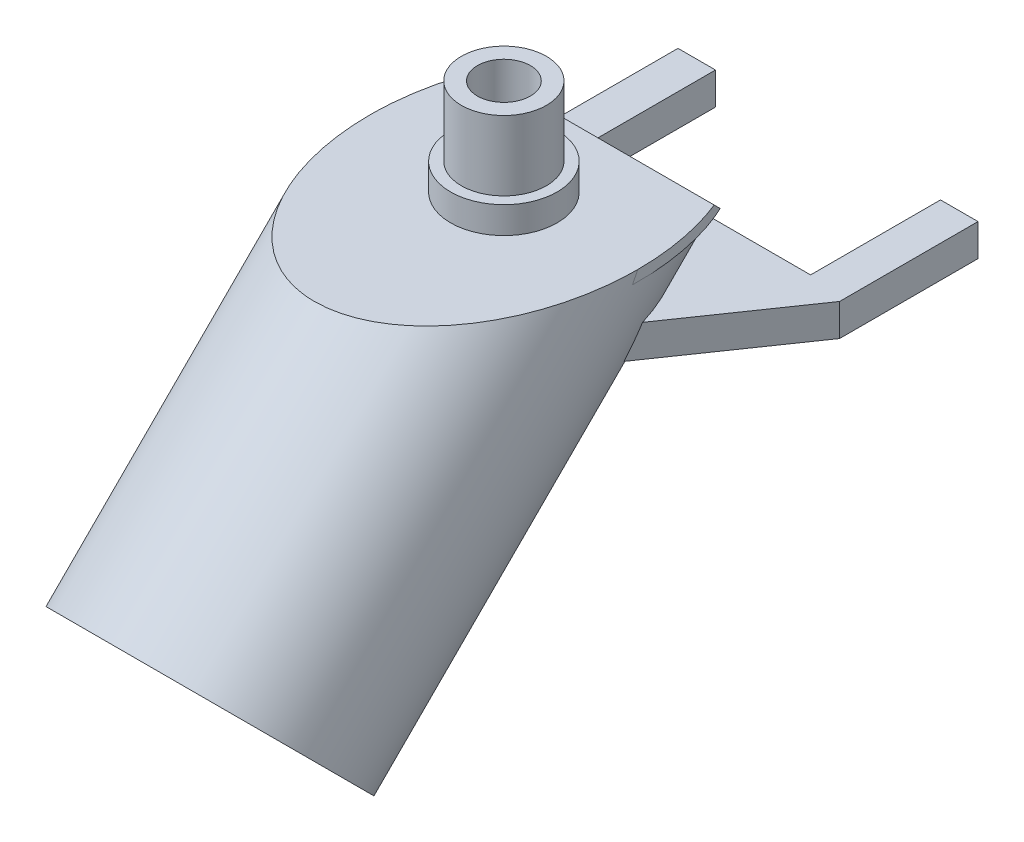
ISO-10303-21;
HEADER;
FILE_DESCRIPTION(('STEP AP214'),'2;1');
FILE_NAME('part.step','',(''),(''),'','','');
FILE_SCHEMA(('AUTOMOTIVE_DESIGN { 1 0 10303 214 1 1 1 1 }'));
ENDSEC;
DATA;
#1=APPLICATION_CONTEXT('core data for automotive mechanical design processes');
#2=APPLICATION_PROTOCOL_DEFINITION('international standard','automotive_design',2000,#1);
#3=PRODUCT_CONTEXT('',#1,'mechanical');
#4=PRODUCT('Part','Part','',(#3));
#5=PRODUCT_RELATED_PRODUCT_CATEGORY('part','',(#4));
#6=PRODUCT_DEFINITION_FORMATION('','',#4);
#7=PRODUCT_DEFINITION_CONTEXT('part definition',#1,'design');
#8=PRODUCT_DEFINITION('design','',#6,#7);
#9=PRODUCT_DEFINITION_SHAPE('','',#8);
#10=(LENGTH_UNIT() NAMED_UNIT(*) SI_UNIT(.MILLI.,.METRE.));
#11=(NAMED_UNIT(*) PLANE_ANGLE_UNIT() SI_UNIT($,.RADIAN.));
#12=(NAMED_UNIT(*) SI_UNIT($,.STERADIAN.) SOLID_ANGLE_UNIT());
#13=UNCERTAINTY_MEASURE_WITH_UNIT(LENGTH_MEASURE(1.E-05),#10,'distance_accuracy_value','');
#14=(GEOMETRIC_REPRESENTATION_CONTEXT(3) GLOBAL_UNCERTAINTY_ASSIGNED_CONTEXT((#13)) GLOBAL_UNIT_ASSIGNED_CONTEXT((#10,
#11,#12)) REPRESENTATION_CONTEXT('',''));
#15=CARTESIAN_POINT('',(0.,0.,0.));
#16=DIRECTION('',(0.,0.,1.));
#17=DIRECTION('',(1.,0.,0.));
#18=AXIS2_PLACEMENT_3D('',#15,#16,#17);
#19=CARTESIAN_POINT('',(0.,-54.8629664321684,54.8629664321686));
#20=DIRECTION('',(0.,0.707106781186546,-0.707106781186549));
#21=DIRECTION('',(0.,0.707106781186549,0.707106781186546));
#22=AXIS2_PLACEMENT_3D('',#19,#20,#21);
#23=CYLINDRICAL_SURFACE('',#22,23.);
#24=CARTESIAN_POINT('',(0.,-2.00000000000001,2.00000000000002));
#25=DIRECTION('',(0.,1.,0.));
#26=DIRECTION('',(0.,0.,-1.));
#27=AXIS2_PLACEMENT_3D('',#24,#25,#26);
#28=ELLIPSE('',#27,32.5269119345813,23.);
#29=CARTESIAN_POINT('',(-18.8066423716891,-2.00000000000001,-16.7248606244953));
#30=VERTEX_POINT('',#29);
#31=CARTESIAN_POINT('',(18.8066423716891,-2.00000000000001,-16.7248606244953));
#32=VERTEX_POINT('',#31);
#33=EDGE_CURVE('E400',#30,#32,#28,.T.);
#34=ORIENTED_EDGE('',*,*,#33,.T.);
#35=CARTESIAN_POINT('',(0.,7.36243031224766,-7.36243031224769));
#36=DIRECTION('',(0.,-0.707106781186546,0.707106781186549));
#37=DIRECTION('',(0.,-0.707106781186549,-0.707106781186546));
#38=AXIS2_PLACEMENT_3D('',#35,#36,#37);
#39=CIRCLE('',#38,23.);
#40=EDGE_CURVE('E401',#32,#30,#39,.F.);
#41=ORIENTED_EDGE('',*,*,#40,.T.);
#42=EDGE_LOOP('',(#34,#41));
#43=FACE_BOUND('',#42,.T.);
#44=CARTESIAN_POINT('',(0.,-54.8629664321684,54.8629664321686));
#45=DIRECTION('',(0.,0.707106781186546,-0.707106781186549));
#46=DIRECTION('',(0.,0.707106781186549,0.707106781186546));
#47=AXIS2_PLACEMENT_3D('',#44,#45,#46);
#48=CIRCLE('',#47,23.);
#49=CARTESIAN_POINT('',(0.,-38.5995104648777,71.1264223994592));
#50=VERTEX_POINT('',#49);
#51=EDGE_CURVE('E798',#50,#50,#48,.T.);
#52=ORIENTED_EDGE('',*,*,#51,.F.);
#53=EDGE_LOOP('',(#52));
#54=FACE_BOUND('',#53,.T.);
#55=CARTESIAN_POINT('',(0.,16.344272077675,-16.344272077675));
#56=DIRECTION('',(0.296808411164219,0.,-0.954937048743095));
#57=DIRECTION('',(-0.27171742693563,0.958664280903814,-0.0844537531353973));
#58=AXIS2_PLACEMENT_3D('',#55,#56,#57);
#59=ELLIPSE('',#58,34.0618389216269,23.);
#60=CARTESIAN_POINT('',(0.436295728987428,-16.3123942294747,-16.2086649795015));
#61=VERTEX_POINT('',#60);
#62=CARTESIAN_POINT('',(9.68143455883345,-16.169768389881,-13.3351405197573));
#63=VERTEX_POINT('',#62);
#64=EDGE_CURVE('E11',#61,#63,#59,.F.);
#65=ORIENTED_EDGE('',*,*,#64,.F.);
#66=CARTESIAN_POINT('',(0.,16.0643257276581,-16.0643257276582));
#67=DIRECTION('',(-0.314087067388576,0.,-0.949394182676113));
#68=DIRECTION('',(0.284489868991285,0.95404790984011,-0.0941174806879096));
#69=AXIS2_PLACEMENT_3D('',#66,#67,#68);
#70=ELLIPSE('',#69,34.2607028019654,23.);
#71=CARTESIAN_POINT('',(-1.99500997651739,-17.,-15.40431869963));
#72=VERTEX_POINT('',#71);
#73=EDGE_CURVE('E418',#72,#61,#70,.F.);
#74=ORIENTED_EDGE('',*,*,#73,.F.);
#75=CARTESIAN_POINT('',(0.,-17.,17.0000000000001));
#76=DIRECTION('',(0.,1.,0.));
#77=DIRECTION('',(0.,0.,-1.));
#78=AXIS2_PLACEMENT_3D('',#75,#76,#77);
#79=ELLIPSE('',#78,32.5269119345813,23.);
#80=CARTESIAN_POINT('',(-8.37607934946873,-17.,-13.2932763078345));
#81=VERTEX_POINT('',#80);
#82=EDGE_CURVE('E202',#81,#72,#79,.F.);
#83=ORIENTED_EDGE('',*,*,#82,.F.);
#84=CARTESIAN_POINT('',(-11.,-16.1405062835473,-12.4252074306241));
#85=VERTEX_POINT('',#84);
#86=EDGE_CURVE('E417',#85,#81,#70,.F.);
#87=ORIENTED_EDGE('',*,*,#86,.F.);
#88=CARTESIAN_POINT('',(0.,23.9714112135515,-23.9714112135516));
#89=DIRECTION('',(-0.724024699699499,0.,-0.689774045775173));
#90=DIRECTION('',(0.404517743876531,0.809985687871733,-0.42460402769168));
#91=AXIS2_PLACEMENT_3D('',#88,#89,#90);
#92=ELLIPSE('',#91,47.1558942146441,23.);
#93=CARTESIAN_POINT('',(-18.,-15.1708335261917,-5.07762320512484));
#94=VERTEX_POINT('',#93);
#95=EDGE_CURVE('E419',#94,#85,#92,.F.);
#96=ORIENTED_EDGE('',*,*,#95,.F.);
#97=DIRECTION('',(0.,0.707106781186546,-0.707106781186549));
#98=VECTOR('',#97,1.);
#99=CARTESIAN_POINT('',(-18.,-64.9871947978267,44.7387380665104));
#100=LINE('',#99,#98);
#101=CARTESIAN_POINT('',(-18.,-11.,-9.24845673131658));
#102=VERTEX_POINT('',#101);
#103=EDGE_CURVE('E304',#94,#102,#100,.T.);
#104=ORIENTED_EDGE('',*,*,#103,.T.);
#105=CARTESIAN_POINT('',(0.,-11.,11.0000000000001));
#106=DIRECTION('',(0.,1.,0.));
#107=DIRECTION('',(0.,0.,-1.));
#108=AXIS2_PLACEMENT_3D('',#105,#106,#107);
#109=ELLIPSE('',#108,32.5269119345813,23.);
#110=CARTESIAN_POINT('',(21.4628238176954,-11.,-0.691637504692517));
#111=VERTEX_POINT('',#110);
#112=EDGE_CURVE('E297',#102,#111,#109,.F.);
#113=ORIENTED_EDGE('',*,*,#112,.T.);
#114=CARTESIAN_POINT('',(0.,-30.4251709059995,30.4251709059997));
#115=DIRECTION('',(-0.823176237286633,0.,-0.567785947665685));
#116=DIRECTION('',(0.360853383397402,0.772064025213345,-0.523165343521545));
#117=AXIS2_PLACEMENT_3D('',#114,#115,#116);
#118=ELLIPSE('',#117,57.287278891469,23.);
#119=CARTESIAN_POINT('',(20.9857667328877,-13.3114683361998,0.));
#120=VERTEX_POINT('',#119);
#121=EDGE_CURVE('E305',#120,#111,#118,.F.);
#122=ORIENTED_EDGE('',*,*,#121,.F.);
#123=CARTESIAN_POINT('',(0.,34.6586425208114,-34.6586425208115));
#124=DIRECTION('',(0.855410771392156,0.,-0.517950202419381));
#125=DIRECTION('',(-0.33668435329228,0.759906592429107,-0.556044617841899));
#126=AXIS2_PLACEMENT_3D('',#123,#124,#125);
#127=ELLIPSE('',#126,62.7993034516556,23.);
#128=CARTESIAN_POINT('',(16.6648778017122,-15.2818508110375,-7.13608164733159));
#129=VERTEX_POINT('',#128);
#130=EDGE_CURVE('E64',#129,#120,#127,.F.);
#131=ORIENTED_EDGE('',*,*,#130,.F.);
#132=CARTESIAN_POINT('',(0.,21.9291507683469,-21.929150768347));
#133=DIRECTION('',(0.663858409766997,0.,-0.747858283220581));
#134=DIRECTION('',(-0.413625006897816,0.833128551140343,-0.367166407700344));
#135=AXIS2_PLACEMENT_3D('',#132,#133,#134);
#136=ELLIPSE('',#135,43.4934166865239,23.);
#137=EDGE_CURVE('E51',#63,#129,#136,.F.);
#138=ORIENTED_EDGE('',*,*,#137,.F.);
#139=EDGE_LOOP('',(#65,#74,#83,#87,#96,#104,#113,#122,#131,#138));
#140=FACE_BOUND('',#139,.T.);
#141=ADVANCED_FACE('F43',(#43,#54,#140),#23,.F.);
#142=CARTESIAN_POINT('',(0.,-2.,0.));
#143=DIRECTION('',(0.,1.,0.));
#144=DIRECTION('',(0.,0.,1.));
#145=AXIS2_PLACEMENT_3D('',#142,#143,#144);
#146=PLANE('',#145);
#147=CARTESIAN_POINT('',(0.,-2.,0.));
#148=DIRECTION('',(0.,1.,0.));
#149=DIRECTION('',(0.,0.,1.));
#150=AXIS2_PLACEMENT_3D('',#147,#148,#149);
#151=CIRCLE('',#150,4.94);
#152=CARTESIAN_POINT('',(0.,-2.,4.94));
#153=VERTEX_POINT('',#152);
#154=EDGE_CURVE('E375',#153,#153,#151,.T.);
#155=ORIENTED_EDGE('',*,*,#154,.T.);
#156=EDGE_LOOP('',(#155));
#157=FACE_BOUND('',#156,.T.);
#158=ORIENTED_EDGE('',*,*,#33,.F.);
#159=DIRECTION('',(1.,0.,0.));
#160=VECTOR('',#159,1.);
#161=CARTESIAN_POINT('',(0.,-2.,-16.7248606244953));
#162=LINE('',#161,#160);
#163=EDGE_CURVE('E310',#30,#32,#162,.T.);
#164=ORIENTED_EDGE('',*,*,#163,.T.);
#165=EDGE_LOOP('',(#158,#164));
#166=FACE_BOUND('',#165,.T.);
#167=ADVANCED_FACE('F342',(#157,#166),#146,.F.);
#168=CARTESIAN_POINT('',(0.,-2.,0.));
#169=DIRECTION('',(0.,1.,0.));
#170=DIRECTION('',(0.,0.,1.));
#171=AXIS2_PLACEMENT_3D('',#168,#169,#170);
#172=ELLIPSE('',#171,35.3553390593275,25.);
#173=DIRECTION('',(0.,1.,0.));
#174=VECTOR('',#173,1.);
#175=SURFACE_OF_LINEAR_EXTRUSION('',#172,#174);
#176=CARTESIAN_POINT('',(24.9899979991996,-2.,0.999999999963205));
#177=VERTEX_POINT('',#176);
#178=CARTESIAN_POINT('',(20.8286934083173,-2.,-19.5532877492415));
#179=VERTEX_POINT('',#178);
#180=EDGE_CURVE('E374',#177,#179,#172,.T.);
#181=ORIENTED_EDGE('',*,*,#180,.T.);
#182=CARTESIAN_POINT('',(20.8286934083173,-2.,-19.5532877492415));
#183=CARTESIAN_POINT('',(20.8805014038306,-1.88962517747914,-19.4429129267206));
#184=CARTESIAN_POINT('',(20.931740309851,-1.77911689654674,-19.3324046457882));
#185=CARTESIAN_POINT('',(21.0330887761514,-1.55785374169068,-19.1111414909322));
#186=CARTESIAN_POINT('',(21.0831984474213,-1.44709889318771,-19.0003866424292));
#187=CARTESIAN_POINT('',(21.1823051300868,-1.22534643576919,-18.7786341850107));
#188=CARTESIAN_POINT('',(21.2313021946021,-1.11434883872185,-18.6676365879634));
#189=CARTESIAN_POINT('',(21.3281992798996,-0.892114725687492,-18.445402474929));
#190=CARTESIAN_POINT('',(21.3760993026859,-0.780878210137318,-18.3341659593788));
#191=CARTESIAN_POINT('',(21.4708175907916,-0.558169148557475,-18.111456897799));
#192=CARTESIAN_POINT('',(21.5176358022585,-0.446696591077869,-17.9999843403194));
#193=CARTESIAN_POINT('',(21.6102047567099,-0.223518395907082,-17.7768061451486));
#194=CARTESIAN_POINT('',(21.6559553963064,-0.111812736773264,-17.6651004860148));
#195=CARTESIAN_POINT('',(21.701176110897,0.,-17.5532877492415));
#196=B_SPLINE_CURVE_WITH_KNOTS('',3,(#182,#183,#184,#185,#186,#187,#188,#189,#190,#191,#192,
#193,#194,#195),.UNSPECIFIED.,.F.,.F.,(4,2,2,2,2,2,4),(0.,0.493398586654441,0.986748464902989,
1.48007473922649,1.97340011231081,2.46674999048073,2.96014745000013),.UNSPECIFIED.);
#197=CARTESIAN_POINT('',(21.701176110897,0.,-17.5532877492415));
#198=VERTEX_POINT('',#197);
#199=EDGE_CURVE('E321',#179,#198,#196,.T.);
#200=ORIENTED_EDGE('',*,*,#199,.T.);
#201=CARTESIAN_POINT('',(0.,0.,0.));
#202=DIRECTION('',(0.,1.,0.));
#203=DIRECTION('',(0.,0.,1.));
#204=AXIS2_PLACEMENT_3D('',#201,#202,#203);
#205=ELLIPSE('',#204,35.3553390593275,25.);
#206=CARTESIAN_POINT('',(25.,0.,0.));
#207=VERTEX_POINT('',#206);
#208=EDGE_CURVE('E381',#207,#198,#205,.T.);
#209=ORIENTED_EDGE('',*,*,#208,.F.);
#210=CARTESIAN_POINT('',(24.9899979991996,-2.,1.00000000000001));
#211=CARTESIAN_POINT('',(24.9964963801354,-1.35030025188276,0.675150125988896));
#212=CARTESIAN_POINT('',(24.9998282230233,-0.700593847209135,0.350296923653296));
#213=CARTESIAN_POINT('',(24.9999978430183,-0.0339205285220589,0.0169602642635038));
#214=CARTESIAN_POINT('',(25.0000000003973,-0.0169602665290214,0.00848013326577682));
#215=CARTESIAN_POINT('',(25.,0.,0.));
#216=B_SPLINE_CURVE_WITH_KNOTS('',3,(#210,#211,#212,#213,#214,#215),.UNSPECIFIED.,.F.,.F.,(4,2,
4),(0.,2.17920445315897,2.23609090162773),.UNSPECIFIED.);
#217=EDGE_CURVE('E366',#177,#207,#216,.T.);
#218=ORIENTED_EDGE('',*,*,#217,.F.);
#219=EDGE_LOOP('',(#181,#200,#209,#218));
#220=FACE_BOUND('',#219,.T.);
#221=ADVANCED_FACE('F329',(#220),#175,.T.);
#222=CARTESIAN_POINT('',(-21.701176110897,0.,-17.5532877492415));
#223=VERTEX_POINT('',#222);
#224=CARTESIAN_POINT('',(-25.,0.,0.));
#225=VERTEX_POINT('',#224);
#226=EDGE_CURVE('E372',#223,#225,#205,.T.);
#227=ORIENTED_EDGE('',*,*,#226,.F.);
#228=CARTESIAN_POINT('',(-21.701176110897,0.,-17.5532877492415));
#229=CARTESIAN_POINT('',(-21.6559553963064,-0.111812736773265,-17.6651004860148));
#230=CARTESIAN_POINT('',(-21.6102047567099,-0.223518395907084,-17.7768061451486));
#231=CARTESIAN_POINT('',(-21.5176358022585,-0.446696591077872,-17.9999843403194));
#232=CARTESIAN_POINT('',(-21.4708175907916,-0.558169148557479,-18.111456897799));
#233=CARTESIAN_POINT('',(-21.3760993026859,-0.780878210137321,-18.3341659593788));
#234=CARTESIAN_POINT('',(-21.3281992798996,-0.892114725687494,-18.445402474929));
#235=CARTESIAN_POINT('',(-21.2313021946021,-1.11434883872185,-18.6676365879634));
#236=CARTESIAN_POINT('',(-21.1823051300868,-1.22534643576919,-18.7786341850107));
#237=CARTESIAN_POINT('',(-21.0831984474213,-1.44709889318771,-19.0003866424292));
#238=CARTESIAN_POINT('',(-21.0330887761514,-1.55785374169068,-19.1111414909322));
#239=CARTESIAN_POINT('',(-20.931740309851,-1.77911689654674,-19.3324046457882));
#240=CARTESIAN_POINT('',(-20.8805014038306,-1.88962517747914,-19.4429129267206));
#241=CARTESIAN_POINT('',(-20.8286934083173,-2.,-19.5532877492415));
#242=B_SPLINE_CURVE_WITH_KNOTS('',3,(#228,#229,#230,#231,#232,#233,#234,#235,#236,#237,#238,
#239,#240,#241),.UNSPECIFIED.,.F.,.F.,(4,2,2,2,2,2,4),(0.,0.493397459519402,0.986747337689313,
1.48007271077364,1.97339898509713,2.46674886334568,2.96014745000012),.UNSPECIFIED.);
#243=CARTESIAN_POINT('',(-20.8286934083173,-2.,-19.5532877492415));
#244=VERTEX_POINT('',#243);
#245=EDGE_CURVE('E312',#223,#244,#242,.T.);
#246=ORIENTED_EDGE('',*,*,#245,.T.);
#247=CARTESIAN_POINT('',(-24.9899979991996,-2.,0.999999999963205));
#248=VERTEX_POINT('',#247);
#249=EDGE_CURVE('E379',#244,#248,#172,.T.);
#250=ORIENTED_EDGE('',*,*,#249,.T.);
#251=CARTESIAN_POINT('',(-24.9899979991996,-2.,0.999999999999999));
#252=CARTESIAN_POINT('',(-24.9964963801355,-1.35030025191845,0.675150125917529));
#253=CARTESIAN_POINT('',(-24.9998282230233,-0.700593847245729,0.350296923580118));
#254=CARTESIAN_POINT('',(-24.9999978430183,-0.0339205285239066,0.0169602642598314));
#255=CARTESIAN_POINT('',(-25.0000000003973,-0.0169602665299625,0.00848013326392048));
#256=CARTESIAN_POINT('',(-25.,0.,0.));
#257=B_SPLINE_CURVE_WITH_KNOTS('',3,(#251,#252,#253,#254,#255,#256),.UNSPECIFIED.,.F.,.F.,(4,2,
4),(0.,2.17920445315896,2.23609090162771),.UNSPECIFIED.);
#258=EDGE_CURVE('E360',#225,#248,#257,.F.);
#259=ORIENTED_EDGE('',*,*,#258,.F.);
#260=EDGE_LOOP('',(#227,#246,#250,#259));
#261=FACE_BOUND('',#260,.T.);
#262=ADVANCED_FACE('F678',(#261),#175,.T.);
#263=DIRECTION('',(-1.,0.,0.));
#264=VECTOR('',#263,1.);
#265=CARTESIAN_POINT('',(0.,-2.,-19.5532877492415));
#266=LINE('',#265,#264);
#267=CARTESIAN_POINT('',(19.8173634371275,-2.00000000000001,-19.5532877492415));
#268=VERTEX_POINT('',#267);
#269=EDGE_CURVE('E315',#179,#268,#266,.T.);
#270=ORIENTED_EDGE('',*,*,#269,.F.);
#271=ORIENTED_EDGE('',*,*,#180,.F.);
#272=CARTESIAN_POINT('',(0.,-2.00000000000001,2.00000000000002));
#273=DIRECTION('',(0.,1.,0.));
#274=DIRECTION('',(0.,0.,-1.));
#275=AXIS2_PLACEMENT_3D('',#272,#273,#274);
#276=ELLIPSE('',#275,35.3553390593275,25.);
#277=EDGE_CURVE('E786',#177,#268,#276,.T.);
#278=ORIENTED_EDGE('',*,*,#277,.T.);
#279=EDGE_LOOP('',(#270,#271,#278));
#280=FACE_BOUND('',#279,.T.);
#281=ADVANCED_FACE('F669',(#280),#146,.F.);
#282=CARTESIAN_POINT('',(-19.8173634371275,-2.00000000000001,-19.5532877492415));
#283=VERTEX_POINT('',#282);
#284=EDGE_CURVE('E309',#283,#244,#266,.T.);
#285=ORIENTED_EDGE('',*,*,#284,.F.);
#286=EDGE_CURVE('E789',#283,#248,#276,.T.);
#287=ORIENTED_EDGE('',*,*,#286,.T.);
#288=ORIENTED_EDGE('',*,*,#249,.F.);
#289=EDGE_LOOP('',(#285,#287,#288));
#290=FACE_BOUND('',#289,.T.);
#291=ADVANCED_FACE('F666',(#290),#146,.F.);
#292=CARTESIAN_POINT('',(0.,0.,0.));
#293=DIRECTION('',(0.,1.,0.));
#294=DIRECTION('',(0.,0.,1.));
#295=AXIS2_PLACEMENT_3D('',#292,#293,#294);
#296=PLANE('',#295);
#297=CARTESIAN_POINT('',(0.,0.,0.));
#298=DIRECTION('',(0.,1.,0.));
#299=DIRECTION('',(0.,0.,1.));
#300=AXIS2_PLACEMENT_3D('',#297,#298,#299);
#301=CIRCLE('',#300,9.94);
#302=CARTESIAN_POINT('',(0.,0.,9.94));
#303=VERTEX_POINT('',#302);
#304=EDGE_CURVE('E378',#303,#303,#301,.T.);
#305=ORIENTED_EDGE('',*,*,#304,.F.);
#306=EDGE_LOOP('',(#305));
#307=FACE_BOUND('',#306,.T.);
#308=ORIENTED_EDGE('',*,*,#208,.T.);
#309=DIRECTION('',(-1.,0.,0.));
#310=VECTOR('',#309,1.);
#311=CARTESIAN_POINT('',(0.,0.,-17.5532877492415));
#312=LINE('',#311,#310);
#313=EDGE_CURVE('E776',#198,#223,#312,.T.);
#314=ORIENTED_EDGE('',*,*,#313,.T.);
#315=ORIENTED_EDGE('',*,*,#226,.T.);
#316=EDGE_CURVE('E382',#225,#207,#205,.T.);
#317=ORIENTED_EDGE('',*,*,#316,.T.);
#318=EDGE_LOOP('',(#308,#314,#315,#317));
#319=FACE_BOUND('',#318,.T.);
#320=ADVANCED_FACE('F354',(#307,#319),#296,.T.);
#321=CARTESIAN_POINT('',(0.,-54.8629664321684,54.8629664321686));
#322=DIRECTION('',(0.,0.707106781186546,-0.707106781186549));
#323=DIRECTION('',(0.,0.707106781186549,0.707106781186546));
#324=AXIS2_PLACEMENT_3D('',#321,#322,#323);
#325=CYLINDRICAL_SURFACE('',#324,25.);
#326=CARTESIAN_POINT('',(0.,-11.,11.0000000000001));
#327=DIRECTION('',(0.,1.,0.));
#328=DIRECTION('',(0.,0.,-1.));
#329=AXIS2_PLACEMENT_3D('',#326,#327,#328);
#330=ELLIPSE('',#329,35.3553390593275,25.);
#331=CARTESIAN_POINT('',(-18.,-11.,-13.5356882927706));
#332=VERTEX_POINT('',#331);
#333=CARTESIAN_POINT('',(22.9865996912914,-11.,-2.90080822343224));
#334=VERTEX_POINT('',#333);
#335=EDGE_CURVE('E413',#332,#334,#330,.F.);
#336=ORIENTED_EDGE('',*,*,#335,.F.);
#337=DIRECTION('',(0.,0.707106781186546,-0.707106781186549));
#338=VECTOR('',#337,1.);
#339=CARTESIAN_POINT('',(-18.,-67.1308105785537,42.5951222857834));
#340=LINE('',#339,#338);
#341=CARTESIAN_POINT('',(-18.,-17.,-7.53568829277057));
#342=VERTEX_POINT('',#341);
#343=EDGE_CURVE('E412',#342,#332,#340,.T.);
#344=ORIENTED_EDGE('',*,*,#343,.F.);
#345=CARTESIAN_POINT('',(0.,-17.,17.0000000000001));
#346=DIRECTION('',(0.,1.,0.));
#347=DIRECTION('',(0.,0.,-1.));
#348=AXIS2_PLACEMENT_3D('',#345,#346,#347);
#349=ELLIPSE('',#348,35.3553390593275,25.);
#350=CARTESIAN_POINT('',(21.5769103139741,-17.,-0.857040141228293));
#351=VERTEX_POINT('',#350);
#352=EDGE_CURVE('E409',#342,#351,#349,.F.);
#353=ORIENTED_EDGE('',*,*,#352,.T.);
#354=CARTESIAN_POINT('',(0.,-30.4251709059995,30.4251709059997));
#355=DIRECTION('',(-0.823176237286633,0.,-0.567785947665685));
#356=DIRECTION('',(0.360853383397402,0.772064025213345,-0.523165343521545));
#357=AXIS2_PLACEMENT_3D('',#354,#355,#356);
#358=ELLIPSE('',#357,62.2687814037706,25.);
#359=EDGE_CURVE('E408',#351,#334,#358,.F.);
#360=ORIENTED_EDGE('',*,*,#359,.T.);
#361=EDGE_LOOP('',(#336,#344,#353,#360));
#362=FACE_BOUND('',#361,.T.);
#363=CARTESIAN_POINT('',(0.,-54.8629664321684,54.8629664321686));
#364=DIRECTION('',(0.,0.707106781186546,-0.707106781186549));
#365=DIRECTION('',(0.,0.707106781186549,0.707106781186546));
#366=AXIS2_PLACEMENT_3D('',#363,#364,#365);
#367=CIRCLE('',#366,25.);
#368=CARTESIAN_POINT('',(0.,-37.1852969025046,72.5406359618323));
#369=VERTEX_POINT('',#368);
#370=EDGE_CURVE('E791',#369,#369,#367,.T.);
#371=ORIENTED_EDGE('',*,*,#370,.T.);
#372=EDGE_LOOP('',(#371));
#373=FACE_BOUND('',#372,.T.);
#374=ORIENTED_EDGE('',*,*,#286,.F.);
#375=CARTESIAN_POINT('',(0.,8.77664387462077,-8.77664387462081));
#376=DIRECTION('',(0.,0.707106781186546,-0.707106781186549));
#377=DIRECTION('',(0.,0.707106781186549,0.707106781186546));
#378=AXIS2_PLACEMENT_3D('',#375,#376,#377);
#379=CIRCLE('',#378,25.);
#380=EDGE_CURVE('E399',#283,#268,#379,.F.);
#381=ORIENTED_EDGE('',*,*,#380,.T.);
#382=ORIENTED_EDGE('',*,*,#277,.F.);
#383=ORIENTED_EDGE('',*,*,#217,.T.);
#384=ORIENTED_EDGE('',*,*,#316,.F.);
#385=ORIENTED_EDGE('',*,*,#258,.T.);
#386=EDGE_LOOP('',(#374,#381,#382,#383,#384,#385));
#387=FACE_BOUND('',#386,.T.);
#388=ADVANCED_FACE('F353',(#362,#373,#387),#325,.T.);
#389=CARTESIAN_POINT('',(0.,5.,0.));
#390=DIRECTION('',(0.,-1.,0.));
#391=DIRECTION('',(0.,0.,-1.));
#392=AXIS2_PLACEMENT_3D('',#389,#390,#391);
#393=CYLINDRICAL_SURFACE('',#392,9.94);
#394=CARTESIAN_POINT('',(0.,5.,0.));
#395=DIRECTION('',(0.,1.,0.));
#396=DIRECTION('',(0.,0.,1.));
#397=AXIS2_PLACEMENT_3D('',#394,#395,#396);
#398=CIRCLE('',#397,9.94);
#399=CARTESIAN_POINT('',(0.,5.,9.94));
#400=VERTEX_POINT('',#399);
#401=EDGE_CURVE('E393',#400,#400,#398,.T.);
#402=ORIENTED_EDGE('',*,*,#401,.F.);
#403=EDGE_LOOP('',(#402));
#404=FACE_BOUND('',#403,.T.);
#405=ORIENTED_EDGE('',*,*,#304,.T.);
#406=EDGE_LOOP('',(#405));
#407=FACE_BOUND('',#406,.T.);
#408=ADVANCED_FACE('F44',(#404,#407),#393,.T.);
#409=CARTESIAN_POINT('',(0.,5.,0.));
#410=DIRECTION('',(0.,1.,0.));
#411=DIRECTION('',(0.,0.,1.));
#412=AXIS2_PLACEMENT_3D('',#409,#410,#411);
#413=PLANE('',#412);
#414=CARTESIAN_POINT('',(0.,5.,0.));
#415=DIRECTION('',(0.,1.,0.));
#416=DIRECTION('',(0.,0.,1.));
#417=AXIS2_PLACEMENT_3D('',#414,#415,#416);
#418=CIRCLE('',#417,7.94);
#419=CARTESIAN_POINT('',(0.,5.,7.94));
#420=VERTEX_POINT('',#419);
#421=EDGE_CURVE('E391',#420,#420,#418,.T.);
#422=ORIENTED_EDGE('',*,*,#421,.F.);
#423=EDGE_LOOP('',(#422));
#424=FACE_BOUND('',#423,.T.);
#425=ORIENTED_EDGE('',*,*,#401,.T.);
#426=EDGE_LOOP('',(#425));
#427=FACE_BOUND('',#426,.T.);
#428=ADVANCED_FACE('F744',(#424,#427),#413,.T.);
#429=CARTESIAN_POINT('',(0.,18.,0.));
#430=DIRECTION('',(0.,-1.,0.));
#431=DIRECTION('',(0.,0.,-1.));
#432=AXIS2_PLACEMENT_3D('',#429,#430,#431);
#433=CYLINDRICAL_SURFACE('',#432,4.94);
#434=CARTESIAN_POINT('',(0.,18.,0.));
#435=DIRECTION('',(0.,1.,0.));
#436=DIRECTION('',(0.,0.,1.));
#437=AXIS2_PLACEMENT_3D('',#434,#435,#436);
#438=CIRCLE('',#437,4.94);
#439=CARTESIAN_POINT('',(0.,18.,4.94));
#440=VERTEX_POINT('',#439);
#441=EDGE_CURVE('E383',#440,#440,#438,.T.);
#442=ORIENTED_EDGE('',*,*,#441,.T.);
#443=EDGE_LOOP('',(#442));
#444=FACE_BOUND('',#443,.T.);
#445=ORIENTED_EDGE('',*,*,#154,.F.);
#446=EDGE_LOOP('',(#445));
#447=FACE_BOUND('',#446,.T.);
#448=ADVANCED_FACE('F737',(#444,#447),#433,.F.);
#449=CARTESIAN_POINT('',(0.,18.,0.));
#450=DIRECTION('',(0.,-1.,0.));
#451=DIRECTION('',(0.,0.,-1.));
#452=AXIS2_PLACEMENT_3D('',#449,#450,#451);
#453=CYLINDRICAL_SURFACE('',#452,7.94);
#454=ORIENTED_EDGE('',*,*,#421,.T.);
#455=EDGE_LOOP('',(#454));
#456=FACE_BOUND('',#455,.T.);
#457=CARTESIAN_POINT('',(0.,18.,0.));
#458=DIRECTION('',(0.,1.,0.));
#459=DIRECTION('',(0.,0.,1.));
#460=AXIS2_PLACEMENT_3D('',#457,#458,#459);
#461=CIRCLE('',#460,7.94);
#462=CARTESIAN_POINT('',(0.,18.,7.94));
#463=VERTEX_POINT('',#462);
#464=EDGE_CURVE('E390',#463,#463,#461,.T.);
#465=ORIENTED_EDGE('',*,*,#464,.F.);
#466=EDGE_LOOP('',(#465));
#467=FACE_BOUND('',#466,.T.);
#468=ADVANCED_FACE('F729',(#456,#467),#453,.T.);
#469=CARTESIAN_POINT('',(0.,18.,0.));
#470=DIRECTION('',(0.,1.,0.));
#471=DIRECTION('',(0.,0.,1.));
#472=AXIS2_PLACEMENT_3D('',#469,#470,#471);
#473=PLANE('',#472);
#474=ORIENTED_EDGE('',*,*,#441,.F.);
#475=EDGE_LOOP('',(#474));
#476=FACE_BOUND('',#475,.T.);
#477=ORIENTED_EDGE('',*,*,#464,.T.);
#478=EDGE_LOOP('',(#477));
#479=FACE_BOUND('',#478,.T.);
#480=ADVANCED_FACE('F348',(#476,#479),#473,.T.);
#481=CARTESIAN_POINT('',(0.,-54.8629664321684,54.8629664321686));
#482=DIRECTION('',(0.,0.707106781186546,-0.707106781186549));
#483=DIRECTION('',(0.,0.707106781186549,0.707106781186546));
#484=AXIS2_PLACEMENT_3D('',#481,#482,#483);
#485=PLANE('',#484);
#486=ORIENTED_EDGE('',*,*,#51,.T.);
#487=EDGE_LOOP('',(#486));
#488=FACE_BOUND('',#487,.T.);
#489=ORIENTED_EDGE('',*,*,#370,.F.);
#490=EDGE_LOOP('',(#489));
#491=FACE_BOUND('',#490,.T.);
#492=ADVANCED_FACE('F339',(#488,#491),#485,.F.);
#493=CARTESIAN_POINT('',(0.,8.77664387462075,-8.7766438746208));
#494=DIRECTION('',(0.,0.707106781186546,-0.707106781186549));
#495=DIRECTION('',(0.,0.707106781186549,0.707106781186546));
#496=AXIS2_PLACEMENT_3D('',#493,#494,#495);
#497=PLANE('',#496);
#498=ORIENTED_EDGE('',*,*,#245,.F.);
#499=ORIENTED_EDGE('',*,*,#313,.F.);
#500=ORIENTED_EDGE('',*,*,#199,.F.);
#501=ORIENTED_EDGE('',*,*,#269,.T.);
#502=ORIENTED_EDGE('',*,*,#380,.F.);
#503=ORIENTED_EDGE('',*,*,#284,.T.);
#504=EDGE_LOOP('',(#498,#499,#500,#501,#502,#503));
#505=FACE_BOUND('',#504,.T.);
#506=ADVANCED_FACE('F331',(#505),#497,.T.);
#507=CARTESIAN_POINT('',(-7.247525013546,-9.45499490015171,-24.179855524647));
#508=DIRECTION('',(0.,-0.707106781186546,0.707106781186549));
#509=DIRECTION('',(0.,-0.707106781186549,-0.707106781186546));
#510=AXIS2_PLACEMENT_3D('',#507,#508,#509);
#511=PLANE('',#510);
#512=ORIENTED_EDGE('',*,*,#163,.F.);
#513=ORIENTED_EDGE('',*,*,#40,.F.);
#514=EDGE_LOOP('',(#512,#513));
#515=FACE_BOUND('',#514,.T.);
#516=ADVANCED_FACE('F336',(#515),#511,.T.);
#517=CARTESIAN_POINT('',(0.,-17.,0.));
#518=DIRECTION('',(0.,1.,0.));
#519=DIRECTION('',(0.,0.,1.));
#520=AXIS2_PLACEMENT_3D('',#517,#518,#519);
#521=PLANE('',#520);
#522=ORIENTED_EDGE('',*,*,#352,.F.);
#523=DIRECTION('',(0.,0.,-1.));
#524=VECTOR('',#523,1.);
#525=CARTESIAN_POINT('',(-18.,-17.,0.));
#526=LINE('',#525,#524);
#527=CARTESIAN_POINT('',(-18.,-17.,-50.5));
#528=VERTEX_POINT('',#527);
#529=EDGE_CURVE('E224',#342,#528,#526,.T.);
#530=ORIENTED_EDGE('',*,*,#529,.T.);
#531=DIRECTION('',(1.,0.,0.));
#532=VECTOR('',#531,1.);
#533=CARTESIAN_POINT('',(0.,-17.,-50.5));
#534=LINE('',#533,#532);
#535=CARTESIAN_POINT('',(-11.,-17.,-50.5));
#536=VERTEX_POINT('',#535);
#537=EDGE_CURVE('E223',#528,#536,#534,.T.);
#538=ORIENTED_EDGE('',*,*,#537,.T.);
#539=DIRECTION('',(0.,0.,-1.));
#540=VECTOR('',#539,1.);
#541=CARTESIAN_POINT('',(-11.,-17.,0.));
#542=LINE('',#541,#540);
#543=CARTESIAN_POINT('',(-11.,-17.,-26.2504037271007));
#544=VERTEX_POINT('',#543);
#545=EDGE_CURVE('E218',#544,#536,#542,.T.);
#546=ORIENTED_EDGE('',*,*,#545,.F.);
#547=DIRECTION('',(-1.,0.,0.));
#548=VECTOR('',#547,1.);
#549=CARTESIAN_POINT('',(0.,-17.,-26.2504037271007));
#550=LINE('',#549,#548);
#551=CARTESIAN_POINT('',(31.,-17.,-26.2504037271007));
#552=VERTEX_POINT('',#551);
#553=EDGE_CURVE('E198',#552,#544,#550,.T.);
#554=ORIENTED_EDGE('',*,*,#553,.F.);
#555=DIRECTION('',(0.,0.,-1.));
#556=VECTOR('',#555,1.);
#557=CARTESIAN_POINT('',(31.,-17.,0.));
#558=LINE('',#557,#556);
#559=CARTESIAN_POINT('',(31.,-17.,-50.5));
#560=VERTEX_POINT('',#559);
#561=EDGE_CURVE('E206',#552,#560,#558,.T.);
#562=ORIENTED_EDGE('',*,*,#561,.T.);
#563=DIRECTION('',(1.,0.,0.));
#564=VECTOR('',#563,1.);
#565=CARTESIAN_POINT('',(0.,-17.,-50.5));
#566=LINE('',#565,#564);
#567=CARTESIAN_POINT('',(38.,-17.,-50.5));
#568=VERTEX_POINT('',#567);
#569=EDGE_CURVE('E232',#560,#568,#566,.T.);
#570=ORIENTED_EDGE('',*,*,#569,.T.);
#571=DIRECTION('',(0.,0.,-1.));
#572=VECTOR('',#571,1.);
#573=CARTESIAN_POINT('',(38.,-17.,0.));
#574=LINE('',#573,#572);
#575=CARTESIAN_POINT('',(38.,-17.,-24.6672404956827));
#576=VERTEX_POINT('',#575);
#577=EDGE_CURVE('E235',#576,#568,#574,.T.);
#578=ORIENTED_EDGE('',*,*,#577,.F.);
#579=DIRECTION('',(0.567785947665685,0.,-0.823176237286633));
#580=VECTOR('',#579,1.);
#581=CARTESIAN_POINT('',(14.2203567363993,-17.,9.80849344283141));
#582=LINE('',#581,#580);
#583=EDGE_CURVE('E229',#351,#576,#582,.T.);
#584=ORIENTED_EDGE('',*,*,#583,.F.);
#585=EDGE_LOOP('',(#522,#530,#538,#546,#554,#562,#570,#578,#584));
#586=FACE_BOUND('',#585,.T.);
#587=ADVANCED_FACE('F216',(#586),#521,.F.);
#588=CARTESIAN_POINT('',(0.,-11.,0.));
#589=DIRECTION('',(0.,1.,0.));
#590=DIRECTION('',(0.,0.,1.));
#591=AXIS2_PLACEMENT_3D('',#588,#589,#590);
#592=PLANE('',#591);
#593=DIRECTION('',(0.,0.,-1.));
#594=VECTOR('',#593,1.);
#595=CARTESIAN_POINT('',(-18.,-11.,0.));
#596=LINE('',#595,#594);
#597=CARTESIAN_POINT('',(-18.,-11.,-50.5));
#598=VERTEX_POINT('',#597);
#599=EDGE_CURVE('E244',#332,#598,#596,.T.);
#600=ORIENTED_EDGE('',*,*,#599,.F.);
#601=ORIENTED_EDGE('',*,*,#335,.T.);
#602=DIRECTION('',(0.567785947665685,0.,-0.823176237286633));
#603=VECTOR('',#602,1.);
#604=CARTESIAN_POINT('',(14.2203567363993,-11.,9.80849344283141));
#605=LINE('',#604,#603);
#606=CARTESIAN_POINT('',(38.,-11.,-24.6672404956827));
#607=VERTEX_POINT('',#606);
#608=EDGE_CURVE('E258',#334,#607,#605,.T.);
#609=ORIENTED_EDGE('',*,*,#608,.T.);
#610=DIRECTION('',(0.,0.,-1.));
#611=VECTOR('',#610,1.);
#612=CARTESIAN_POINT('',(38.,-11.,0.));
#613=LINE('',#612,#611);
#614=CARTESIAN_POINT('',(38.,-11.,-50.5));
#615=VERTEX_POINT('',#614);
#616=EDGE_CURVE('E264',#607,#615,#613,.T.);
#617=ORIENTED_EDGE('',*,*,#616,.T.);
#618=DIRECTION('',(1.,0.,0.));
#619=VECTOR('',#618,1.);
#620=CARTESIAN_POINT('',(0.,-11.,-50.5));
#621=LINE('',#620,#619);
#622=CARTESIAN_POINT('',(31.,-11.,-50.5));
#623=VERTEX_POINT('',#622);
#624=EDGE_CURVE('E265',#623,#615,#621,.T.);
#625=ORIENTED_EDGE('',*,*,#624,.F.);
#626=DIRECTION('',(0.,0.,-1.));
#627=VECTOR('',#626,1.);
#628=CARTESIAN_POINT('',(31.,-11.,0.));
#629=LINE('',#628,#627);
#630=CARTESIAN_POINT('',(31.,-11.,-26.2504037271007));
#631=VERTEX_POINT('',#630);
#632=EDGE_CURVE('E240',#631,#623,#629,.T.);
#633=ORIENTED_EDGE('',*,*,#632,.F.);
#634=DIRECTION('',(-1.,0.,0.));
#635=VECTOR('',#634,1.);
#636=CARTESIAN_POINT('',(0.,-11.,-26.2504037271007));
#637=LINE('',#636,#635);
#638=CARTESIAN_POINT('',(-11.,-11.,-26.2504037271007));
#639=VERTEX_POINT('',#638);
#640=EDGE_CURVE('E200',#631,#639,#637,.T.);
#641=ORIENTED_EDGE('',*,*,#640,.T.);
#642=DIRECTION('',(0.,0.,-1.));
#643=VECTOR('',#642,1.);
#644=CARTESIAN_POINT('',(-11.,-11.,0.));
#645=LINE('',#644,#643);
#646=CARTESIAN_POINT('',(-11.,-11.,-50.5));
#647=VERTEX_POINT('',#646);
#648=EDGE_CURVE('E239',#639,#647,#645,.T.);
#649=ORIENTED_EDGE('',*,*,#648,.T.);
#650=DIRECTION('',(1.,0.,0.));
#651=VECTOR('',#650,1.);
#652=CARTESIAN_POINT('',(0.,-11.,-50.5));
#653=LINE('',#652,#651);
#654=EDGE_CURVE('E245',#598,#647,#653,.T.);
#655=ORIENTED_EDGE('',*,*,#654,.F.);
#656=EDGE_LOOP('',(#600,#601,#609,#617,#625,#633,#641,#649,#655));
#657=FACE_BOUND('',#656,.T.);
#658=ADVANCED_FACE('F464',(#657),#592,.T.);
#659=CARTESIAN_POINT('',(0.,-11.,-50.5));
#660=DIRECTION('',(0.,0.,-1.));
#661=DIRECTION('',(-1.,0.,0.));
#662=AXIS2_PLACEMENT_3D('',#659,#660,#661);
#663=PLANE('',#662);
#664=DIRECTION('',(0.,-1.,0.));
#665=VECTOR('',#664,1.);
#666=CARTESIAN_POINT('',(38.,-11.,-50.5));
#667=LINE('',#666,#665);
#668=EDGE_CURVE('E267',#615,#568,#667,.T.);
#669=ORIENTED_EDGE('',*,*,#668,.T.);
#670=ORIENTED_EDGE('',*,*,#569,.F.);
#671=DIRECTION('',(0.,-1.,0.));
#672=VECTOR('',#671,1.);
#673=CARTESIAN_POINT('',(31.,-11.,-50.5));
#674=LINE('',#673,#672);
#675=EDGE_CURVE('E208',#623,#560,#674,.T.);
#676=ORIENTED_EDGE('',*,*,#675,.F.);
#677=ORIENTED_EDGE('',*,*,#624,.T.);
#678=EDGE_LOOP('',(#669,#670,#676,#677));
#679=FACE_BOUND('',#678,.T.);
#680=ADVANCED_FACE('F478',(#679),#663,.T.);
#681=CARTESIAN_POINT('',(38.,-11.,0.));
#682=DIRECTION('',(-1.,0.,0.));
#683=DIRECTION('',(0.,0.,1.));
#684=AXIS2_PLACEMENT_3D('',#681,#682,#683);
#685=PLANE('',#684);
#686=DIRECTION('',(0.,-1.,0.));
#687=VECTOR('',#686,1.);
#688=CARTESIAN_POINT('',(38.,-11.,-24.6672404956827));
#689=LINE('',#688,#687);
#690=EDGE_CURVE('E272',#607,#576,#689,.T.);
#691=ORIENTED_EDGE('',*,*,#690,.T.);
#692=ORIENTED_EDGE('',*,*,#577,.T.);
#693=ORIENTED_EDGE('',*,*,#668,.F.);
#694=ORIENTED_EDGE('',*,*,#616,.F.);
#695=EDGE_LOOP('',(#691,#692,#693,#694));
#696=FACE_BOUND('',#695,.T.);
#697=ADVANCED_FACE('F474',(#696),#685,.F.);
#698=CARTESIAN_POINT('',(14.2203567363993,-11.,9.80849344283141));
#699=DIRECTION('',(-0.823176237286633,0.,-0.567785947665685));
#700=DIRECTION('',(-0.567785947665685,0.,0.823176237286633));
#701=AXIS2_PLACEMENT_3D('',#698,#699,#700);
#702=PLANE('',#701);
#703=ORIENTED_EDGE('',*,*,#359,.F.);
#704=ORIENTED_EDGE('',*,*,#583,.T.);
#705=ORIENTED_EDGE('',*,*,#690,.F.);
#706=ORIENTED_EDGE('',*,*,#608,.F.);
#707=EDGE_LOOP('',(#703,#704,#705,#706));
#708=FACE_BOUND('',#707,.T.);
#709=ADVANCED_FACE('F458',(#708),#702,.F.);
#710=CARTESIAN_POINT('',(-18.,-11.,0.));
#711=DIRECTION('',(-1.,0.,0.));
#712=DIRECTION('',(0.,0.,1.));
#713=AXIS2_PLACEMENT_3D('',#710,#711,#712);
#714=PLANE('',#713);
#715=ORIENTED_EDGE('',*,*,#529,.F.);
#716=ORIENTED_EDGE('',*,*,#343,.T.);
#717=ORIENTED_EDGE('',*,*,#599,.T.);
#718=DIRECTION('',(0.,-1.,0.));
#719=VECTOR('',#718,1.);
#720=CARTESIAN_POINT('',(-18.,-11.,-50.5));
#721=LINE('',#720,#719);
#722=EDGE_CURVE('E292',#598,#528,#721,.T.);
#723=ORIENTED_EDGE('',*,*,#722,.T.);
#724=EDGE_LOOP('',(#715,#716,#717,#723));
#725=FACE_BOUND('',#724,.T.);
#726=ADVANCED_FACE('F470',(#725),#714,.T.);
#727=CARTESIAN_POINT('',(0.,-11.,-50.5));
#728=DIRECTION('',(0.,0.,-1.));
#729=DIRECTION('',(-1.,0.,0.));
#730=AXIS2_PLACEMENT_3D('',#727,#728,#729);
#731=PLANE('',#730);
#732=DIRECTION('',(0.,-1.,0.));
#733=VECTOR('',#732,1.);
#734=CARTESIAN_POINT('',(-11.,-11.,-50.5));
#735=LINE('',#734,#733);
#736=EDGE_CURVE('E294',#647,#536,#735,.T.);
#737=ORIENTED_EDGE('',*,*,#736,.T.);
#738=ORIENTED_EDGE('',*,*,#537,.F.);
#739=ORIENTED_EDGE('',*,*,#722,.F.);
#740=ORIENTED_EDGE('',*,*,#654,.T.);
#741=EDGE_LOOP('',(#737,#738,#739,#740));
#742=FACE_BOUND('',#741,.T.);
#743=ADVANCED_FACE('F477',(#742),#731,.T.);
#744=CARTESIAN_POINT('',(-11.,-11.,0.));
#745=DIRECTION('',(-1.,0.,0.));
#746=DIRECTION('',(0.,0.,1.));
#747=AXIS2_PLACEMENT_3D('',#744,#745,#746);
#748=PLANE('',#747);
#749=DIRECTION('',(0.,-1.,0.));
#750=VECTOR('',#749,1.);
#751=CARTESIAN_POINT('',(-11.,-11.,-26.2504037271007));
#752=LINE('',#751,#750);
#753=EDGE_CURVE('E204',#639,#544,#752,.T.);
#754=ORIENTED_EDGE('',*,*,#753,.T.);
#755=ORIENTED_EDGE('',*,*,#545,.T.);
#756=ORIENTED_EDGE('',*,*,#736,.F.);
#757=ORIENTED_EDGE('',*,*,#648,.F.);
#758=EDGE_LOOP('',(#754,#755,#756,#757));
#759=FACE_BOUND('',#758,.T.);
#760=ADVANCED_FACE('F496',(#759),#748,.F.);
#761=CARTESIAN_POINT('',(0.,-11.,-26.2504037271007));
#762=DIRECTION('',(0.,0.,1.));
#763=DIRECTION('',(1.,0.,0.));
#764=AXIS2_PLACEMENT_3D('',#761,#762,#763);
#765=PLANE('',#764);
#766=DIRECTION('',(0.,-1.,0.));
#767=VECTOR('',#766,1.);
#768=CARTESIAN_POINT('',(31.,-11.,-26.2504037271007));
#769=LINE('',#768,#767);
#770=EDGE_CURVE('E193',#631,#552,#769,.T.);
#771=ORIENTED_EDGE('',*,*,#770,.T.);
#772=ORIENTED_EDGE('',*,*,#553,.T.);
#773=ORIENTED_EDGE('',*,*,#753,.F.);
#774=ORIENTED_EDGE('',*,*,#640,.F.);
#775=EDGE_LOOP('',(#771,#772,#773,#774));
#776=FACE_BOUND('',#775,.T.);
#777=ADVANCED_FACE('F196',(#776),#765,.F.);
#778=CARTESIAN_POINT('',(31.,-11.,0.));
#779=DIRECTION('',(-1.,0.,0.));
#780=DIRECTION('',(0.,0.,1.));
#781=AXIS2_PLACEMENT_3D('',#778,#779,#780);
#782=PLANE('',#781);
#783=ORIENTED_EDGE('',*,*,#675,.T.);
#784=ORIENTED_EDGE('',*,*,#561,.F.);
#785=ORIENTED_EDGE('',*,*,#770,.F.);
#786=ORIENTED_EDGE('',*,*,#632,.T.);
#787=EDGE_LOOP('',(#783,#784,#785,#786));
#788=FACE_BOUND('',#787,.T.);
#789=ADVANCED_FACE('F209',(#788),#782,.T.);
#790=CARTESIAN_POINT('',(-11.9716450881018,-11.,-11.4053154131783));
#791=DIRECTION('',(-0.724024699699499,0.,-0.689774045775173));
#792=DIRECTION('',(-0.689774045775173,0.,0.724024699699499));
#793=AXIS2_PLACEMENT_3D('',#790,#791,#792);
#794=PLANE('',#793);
#795=DIRECTION('',(0.,-1.,0.));
#796=VECTOR('',#795,1.);
#797=CARTESIAN_POINT('',(-18.,-11.,-5.07762320512484));
#798=LINE('',#797,#796);
#799=CARTESIAN_POINT('',(-18.,-11.,-5.07762320512484));
#800=VERTEX_POINT('',#799);
#801=EDGE_CURVE('E287',#800,#94,#798,.T.);
#802=ORIENTED_EDGE('',*,*,#801,.T.);
#803=ORIENTED_EDGE('',*,*,#95,.T.);
#804=DIRECTION('',(0.,-1.,0.));
#805=VECTOR('',#804,1.);
#806=CARTESIAN_POINT('',(-11.,-11.,-12.4252074306241));
#807=LINE('',#806,#805);
#808=CARTESIAN_POINT('',(-11.,-11.,-12.4252074306241));
#809=VERTEX_POINT('',#808);
#810=EDGE_CURVE('E288',#809,#85,#807,.T.);
#811=ORIENTED_EDGE('',*,*,#810,.F.);
#812=DIRECTION('',(0.689774045775173,0.,-0.724024699699499));
#813=VECTOR('',#812,1.);
#814=CARTESIAN_POINT('',(-11.9716450881018,-11.,-11.4053154131783));
#815=LINE('',#814,#813);
#816=EDGE_CURVE('E248',#800,#809,#815,.T.);
#817=ORIENTED_EDGE('',*,*,#816,.F.);
#818=EDGE_LOOP('',(#802,#803,#811,#817));
#819=FACE_BOUND('',#818,.T.);
#820=ADVANCED_FACE('F448',(#819),#794,.F.);
#821=CARTESIAN_POINT('',(-4.79026039946013,-11.,-14.4795689760916));
#822=DIRECTION('',(-0.314087067388576,0.,-0.949394182676113));
#823=DIRECTION('',(-0.949394182676113,0.,0.314087067388576));
#824=AXIS2_PLACEMENT_3D('',#821,#822,#823);
#825=PLANE('',#824);
#826=ORIENTED_EDGE('',*,*,#810,.T.);
#827=ORIENTED_EDGE('',*,*,#86,.T.);
#828=DIRECTION('',(0.949394182676113,0.,-0.314087067388576));
#829=VECTOR('',#828,1.);
#830=CARTESIAN_POINT('',(-4.79026039946013,-17.,-14.4795689760916));
#831=LINE('',#830,#829);
#832=EDGE_CURVE('E227',#81,#72,#831,.T.);
#833=ORIENTED_EDGE('',*,*,#832,.T.);
#834=ORIENTED_EDGE('',*,*,#73,.T.);
#835=DIRECTION('',(0.,-1.,0.));
#836=VECTOR('',#835,1.);
#837=CARTESIAN_POINT('',(0.436295728987428,-11.,-16.2086649795015));
#838=LINE('',#837,#836);
#839=CARTESIAN_POINT('',(0.436295728987428,-11.,-16.2086649795015));
#840=VERTEX_POINT('',#839);
#841=EDGE_CURVE('E284',#840,#61,#838,.T.);
#842=ORIENTED_EDGE('',*,*,#841,.F.);
#843=DIRECTION('',(0.949394182676113,0.,-0.314087067388576));
#844=VECTOR('',#843,1.);
#845=CARTESIAN_POINT('',(-4.79026039946013,-11.,-14.4795689760916));
#846=LINE('',#845,#844);
#847=EDGE_CURVE('E252',#809,#840,#846,.T.);
#848=ORIENTED_EDGE('',*,*,#847,.F.);
#849=EDGE_LOOP('',(#826,#827,#833,#834,#842,#848));
#850=FACE_BOUND('',#849,.T.);
#851=ADVANCED_FACE('F445',(#850),#825,.F.);
#852=CARTESIAN_POINT('',(4.63251175885554,-11.,-14.904419621793));
#853=DIRECTION('',(0.296808411164219,0.,-0.954937048743095));
#854=DIRECTION('',(-0.954937048743095,0.,-0.296808411164219));
#855=AXIS2_PLACEMENT_3D('',#852,#853,#854);
#856=PLANE('',#855);
#857=ORIENTED_EDGE('',*,*,#841,.T.);
#858=ORIENTED_EDGE('',*,*,#64,.T.);
#859=DIRECTION('',(0.,-1.,0.));
#860=VECTOR('',#859,1.);
#861=CARTESIAN_POINT('',(9.68143455883345,-11.,-13.3351405197573));
#862=LINE('',#861,#860);
#863=CARTESIAN_POINT('',(9.68143455883345,-11.,-13.3351405197573));
#864=VERTEX_POINT('',#863);
#865=EDGE_CURVE('E277',#864,#63,#862,.T.);
#866=ORIENTED_EDGE('',*,*,#865,.F.);
#867=DIRECTION('',(0.954937048743095,0.,0.296808411164219));
#868=VECTOR('',#867,1.);
#869=CARTESIAN_POINT('',(4.63251175885554,-11.,-14.904419621793));
#870=LINE('',#869,#868);
#871=EDGE_CURVE('E254',#840,#864,#870,.T.);
#872=ORIENTED_EDGE('',*,*,#871,.F.);
#873=EDGE_LOOP('',(#857,#858,#866,#872));
#874=FACE_BOUND('',#873,.T.);
#875=ADVANCED_FACE('F439',(#874),#856,.F.);
#876=CARTESIAN_POINT('',(10.8872095733673,-11.,-12.2647988498916));
#877=DIRECTION('',(0.663858409766997,0.,-0.747858283220581));
#878=DIRECTION('',(-0.747858283220581,0.,-0.663858409766997));
#879=AXIS2_PLACEMENT_3D('',#876,#877,#878);
#880=PLANE('',#879);
#881=ORIENTED_EDGE('',*,*,#865,.T.);
#882=ORIENTED_EDGE('',*,*,#137,.T.);
#883=DIRECTION('',(0.,-1.,0.));
#884=VECTOR('',#883,1.);
#885=CARTESIAN_POINT('',(16.6648778017122,-11.,-7.13608164733159));
#886=LINE('',#885,#884);
#887=CARTESIAN_POINT('',(16.6648778017122,-11.,-7.13608164733159));
#888=VERTEX_POINT('',#887);
#889=EDGE_CURVE('E276',#888,#129,#886,.T.);
#890=ORIENTED_EDGE('',*,*,#889,.F.);
#891=DIRECTION('',(0.747858283220581,0.,0.663858409766997));
#892=VECTOR('',#891,1.);
#893=CARTESIAN_POINT('',(10.8872095733673,-11.,-12.2647988498916));
#894=LINE('',#893,#892);
#895=EDGE_CURVE('E253',#864,#888,#894,.T.);
#896=ORIENTED_EDGE('',*,*,#895,.F.);
#897=EDGE_LOOP('',(#881,#882,#890,#896));
#898=FACE_BOUND('',#897,.T.);
#899=ADVANCED_FACE('F424',(#898),#880,.F.);
#900=CARTESIAN_POINT('',(15.3558644698774,-11.,-9.29795763215999));
#901=DIRECTION('',(0.855410771392156,0.,-0.517950202419381));
#902=DIRECTION('',(-0.517950202419381,0.,-0.855410771392156));
#903=AXIS2_PLACEMENT_3D('',#900,#901,#902);
#904=PLANE('',#903);
#905=ORIENTED_EDGE('',*,*,#889,.T.);
#906=ORIENTED_EDGE('',*,*,#130,.T.);
#907=DIRECTION('',(0.,-1.,0.));
#908=VECTOR('',#907,1.);
#909=CARTESIAN_POINT('',(20.9857667328877,-11.,0.));
#910=LINE('',#909,#908);
#911=CARTESIAN_POINT('',(20.9857667328877,-11.,0.));
#912=VERTEX_POINT('',#911);
#913=EDGE_CURVE('E274',#912,#120,#910,.T.);
#914=ORIENTED_EDGE('',*,*,#913,.F.);
#915=DIRECTION('',(0.517950202419381,0.,0.855410771392156));
#916=VECTOR('',#915,1.);
#917=CARTESIAN_POINT('',(15.3558644698774,-11.,-9.29795763215999));
#918=LINE('',#917,#916);
#919=EDGE_CURVE('E256',#888,#912,#918,.T.);
#920=ORIENTED_EDGE('',*,*,#919,.F.);
#921=EDGE_LOOP('',(#905,#906,#914,#920));
#922=FACE_BOUND('',#921,.T.);
#923=ADVANCED_FACE('F427',(#922),#904,.F.);
#924=ORIENTED_EDGE('',*,*,#103,.F.);
#925=ORIENTED_EDGE('',*,*,#801,.F.);
#926=EDGE_CURVE('E246',#800,#102,#596,.T.);
#927=ORIENTED_EDGE('',*,*,#926,.T.);
#928=EDGE_LOOP('',(#924,#925,#927));
#929=FACE_BOUND('',#928,.T.);
#930=ADVANCED_FACE('F453',(#929),#714,.T.);
#931=ORIENTED_EDGE('',*,*,#913,.T.);
#932=ORIENTED_EDGE('',*,*,#121,.T.);
#933=EDGE_CURVE('E257',#912,#111,#605,.T.);
#934=ORIENTED_EDGE('',*,*,#933,.F.);
#935=EDGE_LOOP('',(#931,#932,#934));
#936=FACE_BOUND('',#935,.T.);
#937=ADVANCED_FACE('F456',(#936),#702,.F.);
#938=ORIENTED_EDGE('',*,*,#112,.F.);
#939=ORIENTED_EDGE('',*,*,#926,.F.);
#940=ORIENTED_EDGE('',*,*,#816,.T.);
#941=ORIENTED_EDGE('',*,*,#847,.T.);
#942=ORIENTED_EDGE('',*,*,#871,.T.);
#943=ORIENTED_EDGE('',*,*,#895,.T.);
#944=ORIENTED_EDGE('',*,*,#919,.T.);
#945=ORIENTED_EDGE('',*,*,#933,.T.);
#946=EDGE_LOOP('',(#938,#939,#940,#941,#942,#943,#944,#945));
#947=FACE_BOUND('',#946,.T.);
#948=ADVANCED_FACE('F434',(#947),#592,.T.);
#949=ORIENTED_EDGE('',*,*,#832,.F.);
#950=ORIENTED_EDGE('',*,*,#82,.T.);
#951=EDGE_LOOP('',(#949,#950));
#952=FACE_BOUND('',#951,.T.);
#953=ADVANCED_FACE('F447',(#952),#521,.F.);
#954=CLOSED_SHELL('',(#141,#167,#221,#262,#281,#291,#320,#388,#408,#428,#448,#468,#480,#492,
#506,#516,#587,#658,#680,#697,#709,#726,#743,#760,#777,#789,#820,#851,#875,#899,#923,#930,#937,
#948,#953));
#955=MANIFOLD_SOLID_BREP('B2',#954);
#956=ADVANCED_BREP_SHAPE_REPRESENTATION('',(#18,#955),#14);
#957=SHAPE_DEFINITION_REPRESENTATION(#9,#956);
ENDSEC;
END-ISO-10303-21;
